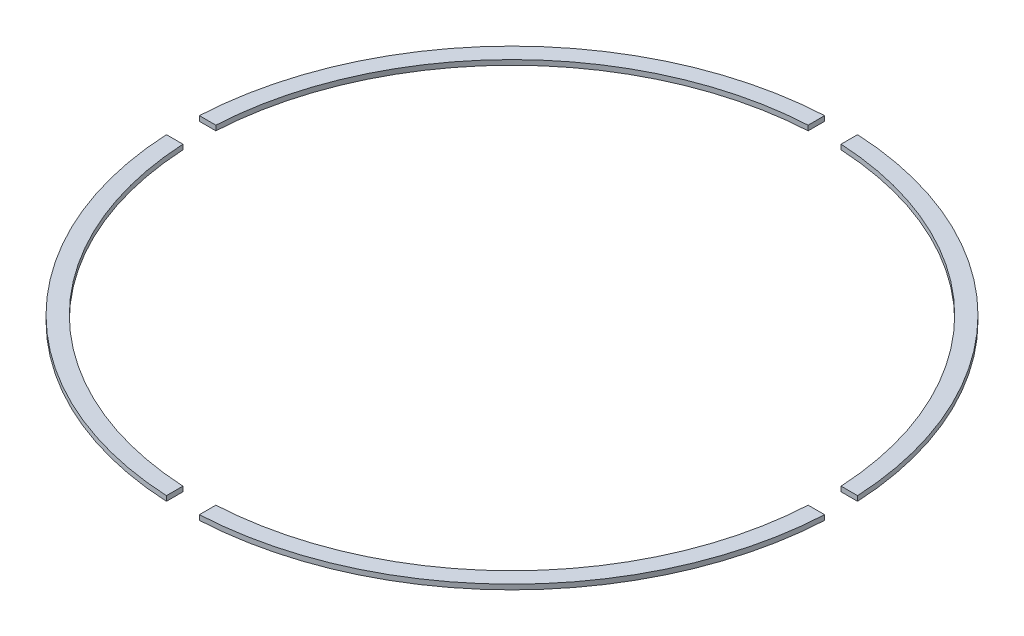
ISO-10303-21;
HEADER;
FILE_DESCRIPTION(('STEP AP214'),'2;1');
FILE_NAME('part.step','',(''),(''),'','','');
FILE_SCHEMA(('AUTOMOTIVE_DESIGN { 1 0 10303 214 1 1 1 1 }'));
ENDSEC;
DATA;
#1=APPLICATION_CONTEXT('core data for automotive mechanical design processes');
#2=APPLICATION_PROTOCOL_DEFINITION('international standard','automotive_design',2000,#1);
#3=PRODUCT_CONTEXT('',#1,'mechanical');
#4=PRODUCT('Part','Part','',(#3));
#5=PRODUCT_RELATED_PRODUCT_CATEGORY('part','',(#4));
#6=PRODUCT_DEFINITION_FORMATION('','',#4);
#7=PRODUCT_DEFINITION_CONTEXT('part definition',#1,'design');
#8=PRODUCT_DEFINITION('design','',#6,#7);
#9=PRODUCT_DEFINITION_SHAPE('','',#8);
#10=(LENGTH_UNIT() NAMED_UNIT(*) SI_UNIT(.MILLI.,.METRE.));
#11=(NAMED_UNIT(*) PLANE_ANGLE_UNIT() SI_UNIT($,.RADIAN.));
#12=(NAMED_UNIT(*) SI_UNIT($,.STERADIAN.) SOLID_ANGLE_UNIT());
#13=UNCERTAINTY_MEASURE_WITH_UNIT(LENGTH_MEASURE(1.E-05),#10,'distance_accuracy_value','');
#14=(GEOMETRIC_REPRESENTATION_CONTEXT(3) GLOBAL_UNCERTAINTY_ASSIGNED_CONTEXT((#13)) GLOBAL_UNIT_ASSIGNED_CONTEXT((#10,
#11,#12)) REPRESENTATION_CONTEXT('',''));
#15=CARTESIAN_POINT('',(0.,0.,0.));
#16=DIRECTION('',(0.,0.,1.));
#17=DIRECTION('',(1.,0.,0.));
#18=AXIS2_PLACEMENT_3D('',#15,#16,#17);
#19=CARTESIAN_POINT('',(0.,1.5,0.));
#20=DIRECTION('',(0.,1.,0.));
#21=DIRECTION('',(0.,0.,1.));
#22=AXIS2_PLACEMENT_3D('',#19,#20,#21);
#23=PLANE('',#22);
#24=DIRECTION('',(-1.,0.,0.));
#25=VECTOR('',#24,1.);
#26=CARTESIAN_POINT('',(200.,1.5,-10.));
#27=LINE('',#26,#25);
#28=CARTESIAN_POINT('',(-189.736659610103,1.5,-10.));
#29=VERTEX_POINT('',#28);
#30=CARTESIAN_POINT('',(-199.749843554382,1.5,-10.));
#31=VERTEX_POINT('',#30);
#32=EDGE_CURVE('E13',#29,#31,#27,.T.);
#33=ORIENTED_EDGE('',*,*,#32,.F.);
#34=CARTESIAN_POINT('',(0.,1.5,0.));
#35=DIRECTION('',(0.,1.,0.));
#36=DIRECTION('',(0.,0.,1.));
#37=AXIS2_PLACEMENT_3D('',#34,#35,#36);
#38=CIRCLE('',#37,190.);
#39=CARTESIAN_POINT('',(-10.,1.5,-189.736659610103));
#40=VERTEX_POINT('',#39);
#41=EDGE_CURVE('E94',#40,#29,#38,.T.);
#42=ORIENTED_EDGE('',*,*,#41,.F.);
#43=DIRECTION('',(0.,0.,1.));
#44=VECTOR('',#43,1.);
#45=CARTESIAN_POINT('',(-10.,1.5,-200.));
#46=LINE('',#45,#44);
#47=CARTESIAN_POINT('',(-10.,1.5,-199.749843554382));
#48=VERTEX_POINT('',#47);
#49=EDGE_CURVE('E128',#48,#40,#46,.T.);
#50=ORIENTED_EDGE('',*,*,#49,.F.);
#51=CARTESIAN_POINT('',(0.,1.5,0.));
#52=DIRECTION('',(0.,1.,0.));
#53=DIRECTION('',(0.,0.,1.));
#54=AXIS2_PLACEMENT_3D('',#51,#52,#53);
#55=CIRCLE('',#54,200.);
#56=EDGE_CURVE('E144',#48,#31,#55,.T.);
#57=ORIENTED_EDGE('',*,*,#56,.T.);
#58=EDGE_LOOP('',(#33,#42,#50,#57));
#59=FACE_BOUND('',#58,.T.);
#60=ADVANCED_FACE('F91',(#59),#23,.T.);
#61=CARTESIAN_POINT('',(0.,-1.5,0.));
#62=DIRECTION('',(0.,1.,0.));
#63=DIRECTION('',(0.,0.,1.));
#64=AXIS2_PLACEMENT_3D('',#61,#62,#63);
#65=PLANE('',#64);
#66=CARTESIAN_POINT('',(0.,-1.5,0.));
#67=DIRECTION('',(0.,1.,0.));
#68=DIRECTION('',(0.,0.,1.));
#69=AXIS2_PLACEMENT_3D('',#66,#67,#68);
#70=CIRCLE('',#69,190.);
#71=CARTESIAN_POINT('',(-10.,-1.5,-189.736659610103));
#72=VERTEX_POINT('',#71);
#73=CARTESIAN_POINT('',(-189.736659610103,-1.5,-10.));
#74=VERTEX_POINT('',#73);
#75=EDGE_CURVE('E158',#72,#74,#70,.T.);
#76=ORIENTED_EDGE('',*,*,#75,.T.);
#77=DIRECTION('',(-1.,0.,0.));
#78=VECTOR('',#77,1.);
#79=CARTESIAN_POINT('',(200.,-1.5,-10.));
#80=LINE('',#79,#78);
#81=CARTESIAN_POINT('',(-199.749843554382,-1.5,-10.));
#82=VERTEX_POINT('',#81);
#83=EDGE_CURVE('E131',#74,#82,#80,.T.);
#84=ORIENTED_EDGE('',*,*,#83,.T.);
#85=CARTESIAN_POINT('',(0.,-1.5,0.));
#86=DIRECTION('',(0.,1.,0.));
#87=DIRECTION('',(0.,0.,1.));
#88=AXIS2_PLACEMENT_3D('',#85,#86,#87);
#89=CIRCLE('',#88,200.);
#90=CARTESIAN_POINT('',(-10.,-1.5,-199.749843554382));
#91=VERTEX_POINT('',#90);
#92=EDGE_CURVE('E153',#91,#82,#89,.T.);
#93=ORIENTED_EDGE('',*,*,#92,.F.);
#94=DIRECTION('',(0.,0.,1.));
#95=VECTOR('',#94,1.);
#96=CARTESIAN_POINT('',(-10.,-1.5,-200.));
#97=LINE('',#96,#95);
#98=EDGE_CURVE('E157',#91,#72,#97,.T.);
#99=ORIENTED_EDGE('',*,*,#98,.T.);
#100=EDGE_LOOP('',(#76,#84,#93,#99));
#101=FACE_BOUND('',#100,.T.);
#102=ADVANCED_FACE('F164',(#101),#65,.F.);
#103=CARTESIAN_POINT('',(0.,1.5,0.));
#104=DIRECTION('',(0.,-1.,0.));
#105=DIRECTION('',(0.,0.,-1.));
#106=AXIS2_PLACEMENT_3D('',#103,#104,#105);
#107=CYLINDRICAL_SURFACE('',#106,200.);
#108=ORIENTED_EDGE('',*,*,#92,.T.);
#109=DIRECTION('',(0.,-1.,0.));
#110=VECTOR('',#109,1.);
#111=CARTESIAN_POINT('',(-199.749843554382,1.5,-10.));
#112=LINE('',#111,#110);
#113=EDGE_CURVE('E108',#82,#31,#112,.F.);
#114=ORIENTED_EDGE('',*,*,#113,.T.);
#115=ORIENTED_EDGE('',*,*,#56,.F.);
#116=DIRECTION('',(0.,-1.,0.));
#117=VECTOR('',#116,1.);
#118=CARTESIAN_POINT('',(-10.,1.5,-199.749843554382));
#119=LINE('',#118,#117);
#120=EDGE_CURVE('E146',#48,#91,#119,.T.);
#121=ORIENTED_EDGE('',*,*,#120,.T.);
#122=EDGE_LOOP('',(#108,#114,#115,#121));
#123=FACE_BOUND('',#122,.T.);
#124=ADVANCED_FACE('F162',(#123),#107,.T.);
#125=CARTESIAN_POINT('',(0.,1.5,0.));
#126=DIRECTION('',(0.,-1.,0.));
#127=DIRECTION('',(0.,0.,-1.));
#128=AXIS2_PLACEMENT_3D('',#125,#126,#127);
#129=CYLINDRICAL_SURFACE('',#128,190.);
#130=DIRECTION('',(0.,-1.,0.));
#131=VECTOR('',#130,1.);
#132=CARTESIAN_POINT('',(-189.736659610103,1.5,-10.));
#133=LINE('',#132,#131);
#134=EDGE_CURVE('E100',#74,#29,#133,.F.);
#135=ORIENTED_EDGE('',*,*,#134,.F.);
#136=ORIENTED_EDGE('',*,*,#75,.F.);
#137=DIRECTION('',(0.,-1.,0.));
#138=VECTOR('',#137,1.);
#139=CARTESIAN_POINT('',(-10.,1.5,-189.736659610103));
#140=LINE('',#139,#138);
#141=EDGE_CURVE('E124',#40,#72,#140,.T.);
#142=ORIENTED_EDGE('',*,*,#141,.F.);
#143=ORIENTED_EDGE('',*,*,#41,.T.);
#144=EDGE_LOOP('',(#135,#136,#142,#143));
#145=FACE_BOUND('',#144,.T.);
#146=ADVANCED_FACE('F145',(#145),#129,.F.);
#147=CARTESIAN_POINT('',(-10.,-1.5,-200.));
#148=DIRECTION('',(-1.,0.,0.));
#149=DIRECTION('',(0.,0.,1.));
#150=AXIS2_PLACEMENT_3D('',#147,#148,#149);
#151=PLANE('',#150);
#152=ORIENTED_EDGE('',*,*,#49,.T.);
#153=ORIENTED_EDGE('',*,*,#141,.T.);
#154=ORIENTED_EDGE('',*,*,#98,.F.);
#155=ORIENTED_EDGE('',*,*,#120,.F.);
#156=EDGE_LOOP('',(#152,#153,#154,#155));
#157=FACE_BOUND('',#156,.T.);
#158=ADVANCED_FACE('F165',(#157),#151,.F.);
#159=CARTESIAN_POINT('',(200.,-1.5,-10.));
#160=DIRECTION('',(0.,0.,-1.));
#161=DIRECTION('',(-1.,0.,0.));
#162=AXIS2_PLACEMENT_3D('',#159,#160,#161);
#163=PLANE('',#162);
#164=ORIENTED_EDGE('',*,*,#83,.F.);
#165=ORIENTED_EDGE('',*,*,#134,.T.);
#166=ORIENTED_EDGE('',*,*,#32,.T.);
#167=ORIENTED_EDGE('',*,*,#113,.F.);
#168=EDGE_LOOP('',(#164,#165,#166,#167));
#169=FACE_BOUND('',#168,.T.);
#170=ADVANCED_FACE('F134',(#169),#163,.F.);
#171=CLOSED_SHELL('',(#60,#102,#124,#146,#158,#170));
#172=MANIFOLD_SOLID_BREP('B2',#171);
#173=CARTESIAN_POINT('',(0.,1.5,0.));
#174=DIRECTION('',(0.,-1.,0.));
#175=DIRECTION('',(0.,0.,-1.));
#176=AXIS2_PLACEMENT_3D('',#173,#174,#175);
#177=CYLINDRICAL_SURFACE('',#176,190.);
#178=CARTESIAN_POINT('',(0.,1.5,0.));
#179=DIRECTION('',(0.,1.,0.));
#180=DIRECTION('',(0.,0.,1.));
#181=AXIS2_PLACEMENT_3D('',#178,#179,#180);
#182=CIRCLE('',#181,190.);
#183=CARTESIAN_POINT('',(10.,1.5,189.736659610103));
#184=VERTEX_POINT('',#183);
#185=CARTESIAN_POINT('',(189.736659610103,1.5,10.));
#186=VERTEX_POINT('',#185);
#187=EDGE_CURVE('E280',#184,#186,#182,.T.);
#188=ORIENTED_EDGE('',*,*,#187,.T.);
#189=DIRECTION('',(0.,-1.,0.));
#190=VECTOR('',#189,1.);
#191=CARTESIAN_POINT('',(189.736659610103,1.5,10.));
#192=LINE('',#191,#190);
#193=CARTESIAN_POINT('',(189.736659610103,-1.5,10.));
#194=VERTEX_POINT('',#193);
#195=EDGE_CURVE('E270',#186,#194,#192,.T.);
#196=ORIENTED_EDGE('',*,*,#195,.T.);
#197=CARTESIAN_POINT('',(0.,-1.5,0.));
#198=DIRECTION('',(0.,1.,0.));
#199=DIRECTION('',(0.,0.,1.));
#200=AXIS2_PLACEMENT_3D('',#197,#198,#199);
#201=CIRCLE('',#200,190.);
#202=CARTESIAN_POINT('',(10.,-1.5,189.736659610103));
#203=VERTEX_POINT('',#202);
#204=EDGE_CURVE('E278',#203,#194,#201,.T.);
#205=ORIENTED_EDGE('',*,*,#204,.F.);
#206=DIRECTION('',(0.,-1.,0.));
#207=VECTOR('',#206,1.);
#208=CARTESIAN_POINT('',(10.,1.5,189.736659610103));
#209=LINE('',#208,#207);
#210=EDGE_CURVE('E263',#203,#184,#209,.F.);
#211=ORIENTED_EDGE('',*,*,#210,.T.);
#212=EDGE_LOOP('',(#188,#196,#205,#211));
#213=FACE_BOUND('',#212,.T.);
#214=ADVANCED_FACE('F224',(#213),#177,.F.);
#215=CARTESIAN_POINT('',(0.,1.5,0.));
#216=DIRECTION('',(0.,-1.,0.));
#217=DIRECTION('',(0.,0.,-1.));
#218=AXIS2_PLACEMENT_3D('',#215,#216,#217);
#219=CYLINDRICAL_SURFACE('',#218,200.);
#220=DIRECTION('',(0.,-1.,0.));
#221=VECTOR('',#220,1.);
#222=CARTESIAN_POINT('',(199.749843554382,1.5,10.));
#223=LINE('',#222,#221);
#224=CARTESIAN_POINT('',(199.749843554382,1.5,10.));
#225=VERTEX_POINT('',#224);
#226=CARTESIAN_POINT('',(199.749843554382,-1.5,10.));
#227=VERTEX_POINT('',#226);
#228=EDGE_CURVE('E234',#225,#227,#223,.T.);
#229=ORIENTED_EDGE('',*,*,#228,.F.);
#230=CARTESIAN_POINT('',(0.,1.5,0.));
#231=DIRECTION('',(0.,1.,0.));
#232=DIRECTION('',(0.,0.,1.));
#233=AXIS2_PLACEMENT_3D('',#230,#231,#232);
#234=CIRCLE('',#233,200.);
#235=CARTESIAN_POINT('',(10.,1.5,199.749843554382));
#236=VERTEX_POINT('',#235);
#237=EDGE_CURVE('E283',#236,#225,#234,.T.);
#238=ORIENTED_EDGE('',*,*,#237,.F.);
#239=DIRECTION('',(0.,-1.,0.));
#240=VECTOR('',#239,1.);
#241=CARTESIAN_POINT('',(10.,1.5,199.749843554382));
#242=LINE('',#241,#240);
#243=CARTESIAN_POINT('',(10.,-1.5,199.749843554382));
#244=VERTEX_POINT('',#243);
#245=EDGE_CURVE('E290',#244,#236,#242,.F.);
#246=ORIENTED_EDGE('',*,*,#245,.F.);
#247=CARTESIAN_POINT('',(0.,-1.5,0.));
#248=DIRECTION('',(0.,1.,0.));
#249=DIRECTION('',(0.,0.,1.));
#250=AXIS2_PLACEMENT_3D('',#247,#248,#249);
#251=CIRCLE('',#250,200.);
#252=EDGE_CURVE('E228',#244,#227,#251,.T.);
#253=ORIENTED_EDGE('',*,*,#252,.T.);
#254=EDGE_LOOP('',(#229,#238,#246,#253));
#255=FACE_BOUND('',#254,.T.);
#256=ADVANCED_FACE('F297',(#255),#219,.T.);
#257=CARTESIAN_POINT('',(0.,-1.5,0.));
#258=DIRECTION('',(0.,1.,0.));
#259=DIRECTION('',(0.,0.,1.));
#260=AXIS2_PLACEMENT_3D('',#257,#258,#259);
#261=PLANE('',#260);
#262=DIRECTION('',(-1.,0.,0.));
#263=VECTOR('',#262,1.);
#264=CARTESIAN_POINT('',(200.,-1.5,10.));
#265=LINE('',#264,#263);
#266=EDGE_CURVE('E89',#227,#194,#265,.T.);
#267=ORIENTED_EDGE('',*,*,#266,.F.);
#268=ORIENTED_EDGE('',*,*,#252,.F.);
#269=DIRECTION('',(0.,0.,1.));
#270=VECTOR('',#269,1.);
#271=CARTESIAN_POINT('',(10.,-1.5,-200.));
#272=LINE('',#271,#270);
#273=EDGE_CURVE('E259',#203,#244,#272,.T.);
#274=ORIENTED_EDGE('',*,*,#273,.F.);
#275=ORIENTED_EDGE('',*,*,#204,.T.);
#276=EDGE_LOOP('',(#267,#268,#274,#275));
#277=FACE_BOUND('',#276,.T.);
#278=ADVANCED_FACE('F282',(#277),#261,.F.);
#279=CARTESIAN_POINT('',(0.,1.5,0.));
#280=DIRECTION('',(0.,1.,0.));
#281=DIRECTION('',(0.,0.,1.));
#282=AXIS2_PLACEMENT_3D('',#279,#280,#281);
#283=PLANE('',#282);
#284=ORIENTED_EDGE('',*,*,#237,.T.);
#285=DIRECTION('',(-1.,0.,0.));
#286=VECTOR('',#285,1.);
#287=CARTESIAN_POINT('',(200.,1.5,10.));
#288=LINE('',#287,#286);
#289=EDGE_CURVE('E243',#225,#186,#288,.T.);
#290=ORIENTED_EDGE('',*,*,#289,.T.);
#291=ORIENTED_EDGE('',*,*,#187,.F.);
#292=DIRECTION('',(0.,0.,1.));
#293=VECTOR('',#292,1.);
#294=CARTESIAN_POINT('',(10.,1.5,-200.));
#295=LINE('',#294,#293);
#296=EDGE_CURVE('E265',#184,#236,#295,.T.);
#297=ORIENTED_EDGE('',*,*,#296,.T.);
#298=EDGE_LOOP('',(#284,#290,#291,#297));
#299=FACE_BOUND('',#298,.T.);
#300=ADVANCED_FACE('F226',(#299),#283,.T.);
#301=CARTESIAN_POINT('',(10.,-1.5,-200.));
#302=DIRECTION('',(-1.,0.,0.));
#303=DIRECTION('',(0.,0.,1.));
#304=AXIS2_PLACEMENT_3D('',#301,#302,#303);
#305=PLANE('',#304);
#306=ORIENTED_EDGE('',*,*,#245,.T.);
#307=ORIENTED_EDGE('',*,*,#296,.F.);
#308=ORIENTED_EDGE('',*,*,#210,.F.);
#309=ORIENTED_EDGE('',*,*,#273,.T.);
#310=EDGE_LOOP('',(#306,#307,#308,#309));
#311=FACE_BOUND('',#310,.T.);
#312=ADVANCED_FACE('F298',(#311),#305,.T.);
#313=CARTESIAN_POINT('',(200.,-1.5,10.));
#314=DIRECTION('',(0.,0.,-1.));
#315=DIRECTION('',(-1.,0.,0.));
#316=AXIS2_PLACEMENT_3D('',#313,#314,#315);
#317=PLANE('',#316);
#318=ORIENTED_EDGE('',*,*,#228,.T.);
#319=ORIENTED_EDGE('',*,*,#266,.T.);
#320=ORIENTED_EDGE('',*,*,#195,.F.);
#321=ORIENTED_EDGE('',*,*,#289,.F.);
#322=EDGE_LOOP('',(#318,#319,#320,#321));
#323=FACE_BOUND('',#322,.T.);
#324=ADVANCED_FACE('F269',(#323),#317,.T.);
#325=CLOSED_SHELL('',(#214,#256,#278,#300,#312,#324));
#326=MANIFOLD_SOLID_BREP('B7',#325);
#327=CARTESIAN_POINT('',(0.,1.5,0.));
#328=DIRECTION('',(0.,-1.,0.));
#329=DIRECTION('',(0.,0.,-1.));
#330=AXIS2_PLACEMENT_3D('',#327,#328,#329);
#331=CYLINDRICAL_SURFACE('',#330,200.);
#332=DIRECTION('',(0.,-1.,0.));
#333=VECTOR('',#332,1.);
#334=CARTESIAN_POINT('',(-199.749843554382,1.5,10.));
#335=LINE('',#334,#333);
#336=CARTESIAN_POINT('',(-199.749843554382,-1.5,10.));
#337=VERTEX_POINT('',#336);
#338=CARTESIAN_POINT('',(-199.749843554382,1.5,10.));
#339=VERTEX_POINT('',#338);
#340=EDGE_CURVE('E366',#337,#339,#335,.F.);
#341=ORIENTED_EDGE('',*,*,#340,.F.);
#342=CARTESIAN_POINT('',(0.,-1.5,0.));
#343=DIRECTION('',(0.,1.,0.));
#344=DIRECTION('',(0.,0.,1.));
#345=AXIS2_PLACEMENT_3D('',#342,#343,#344);
#346=CIRCLE('',#345,200.);
#347=CARTESIAN_POINT('',(-10.,-1.5,199.749843554382));
#348=VERTEX_POINT('',#347);
#349=EDGE_CURVE('E407',#337,#348,#346,.T.);
#350=ORIENTED_EDGE('',*,*,#349,.T.);
#351=DIRECTION('',(0.,-1.,0.));
#352=VECTOR('',#351,1.);
#353=CARTESIAN_POINT('',(-10.,1.5,199.749843554382));
#354=LINE('',#353,#352);
#355=CARTESIAN_POINT('',(-10.,1.5,199.749843554382));
#356=VERTEX_POINT('',#355);
#357=EDGE_CURVE('E400',#348,#356,#354,.F.);
#358=ORIENTED_EDGE('',*,*,#357,.T.);
#359=CARTESIAN_POINT('',(0.,1.5,0.));
#360=DIRECTION('',(0.,1.,0.));
#361=DIRECTION('',(0.,0.,1.));
#362=AXIS2_PLACEMENT_3D('',#359,#360,#361);
#363=CIRCLE('',#362,200.);
#364=EDGE_CURVE('E419',#339,#356,#363,.T.);
#365=ORIENTED_EDGE('',*,*,#364,.F.);
#366=EDGE_LOOP('',(#341,#350,#358,#365));
#367=FACE_BOUND('',#366,.T.);
#368=ADVANCED_FACE('F356',(#367),#331,.T.);
#369=CARTESIAN_POINT('',(0.,1.5,0.));
#370=DIRECTION('',(0.,-1.,0.));
#371=DIRECTION('',(0.,0.,-1.));
#372=AXIS2_PLACEMENT_3D('',#369,#370,#371);
#373=CYLINDRICAL_SURFACE('',#372,190.);
#374=CARTESIAN_POINT('',(0.,-1.5,0.));
#375=DIRECTION('',(0.,1.,0.));
#376=DIRECTION('',(0.,0.,1.));
#377=AXIS2_PLACEMENT_3D('',#374,#375,#376);
#378=CIRCLE('',#377,190.);
#379=CARTESIAN_POINT('',(-189.736659610103,-1.5,10.));
#380=VERTEX_POINT('',#379);
#381=CARTESIAN_POINT('',(-10.,-1.5,189.736659610103));
#382=VERTEX_POINT('',#381);
#383=EDGE_CURVE('E414',#380,#382,#378,.T.);
#384=ORIENTED_EDGE('',*,*,#383,.F.);
#385=DIRECTION('',(0.,-1.,0.));
#386=VECTOR('',#385,1.);
#387=CARTESIAN_POINT('',(-189.736659610103,1.5,10.));
#388=LINE('',#387,#386);
#389=CARTESIAN_POINT('',(-189.736659610103,1.5,10.));
#390=VERTEX_POINT('',#389);
#391=EDGE_CURVE('E406',#380,#390,#388,.F.);
#392=ORIENTED_EDGE('',*,*,#391,.T.);
#393=CARTESIAN_POINT('',(0.,1.5,0.));
#394=DIRECTION('',(0.,1.,0.));
#395=DIRECTION('',(0.,0.,1.));
#396=AXIS2_PLACEMENT_3D('',#393,#394,#395);
#397=CIRCLE('',#396,190.);
#398=CARTESIAN_POINT('',(-10.,1.5,189.736659610103));
#399=VERTEX_POINT('',#398);
#400=EDGE_CURVE('E360',#390,#399,#397,.T.);
#401=ORIENTED_EDGE('',*,*,#400,.T.);
#402=DIRECTION('',(0.,-1.,0.));
#403=VECTOR('',#402,1.);
#404=CARTESIAN_POINT('',(-10.,1.5,189.736659610103));
#405=LINE('',#404,#403);
#406=EDGE_CURVE('E389',#382,#399,#405,.F.);
#407=ORIENTED_EDGE('',*,*,#406,.F.);
#408=EDGE_LOOP('',(#384,#392,#401,#407));
#409=FACE_BOUND('',#408,.T.);
#410=ADVANCED_FACE('F435',(#409),#373,.F.);
#411=CARTESIAN_POINT('',(0.,-1.5,0.));
#412=DIRECTION('',(0.,1.,0.));
#413=DIRECTION('',(0.,0.,1.));
#414=AXIS2_PLACEMENT_3D('',#411,#412,#413);
#415=PLANE('',#414);
#416=DIRECTION('',(-1.,0.,0.));
#417=VECTOR('',#416,1.);
#418=CARTESIAN_POINT('',(200.,-1.5,10.));
#419=LINE('',#418,#417);
#420=EDGE_CURVE('E222',#380,#337,#419,.T.);
#421=ORIENTED_EDGE('',*,*,#420,.F.);
#422=ORIENTED_EDGE('',*,*,#383,.T.);
#423=DIRECTION('',(0.,0.,1.));
#424=VECTOR('',#423,1.);
#425=CARTESIAN_POINT('',(-10.,-1.5,-200.));
#426=LINE('',#425,#424);
#427=EDGE_CURVE('E394',#382,#348,#426,.T.);
#428=ORIENTED_EDGE('',*,*,#427,.T.);
#429=ORIENTED_EDGE('',*,*,#349,.F.);
#430=EDGE_LOOP('',(#421,#422,#428,#429));
#431=FACE_BOUND('',#430,.T.);
#432=ADVANCED_FACE('F412',(#431),#415,.F.);
#433=CARTESIAN_POINT('',(0.,1.5,0.));
#434=DIRECTION('',(0.,1.,0.));
#435=DIRECTION('',(0.,0.,1.));
#436=AXIS2_PLACEMENT_3D('',#433,#434,#435);
#437=PLANE('',#436);
#438=ORIENTED_EDGE('',*,*,#400,.F.);
#439=DIRECTION('',(-1.,0.,0.));
#440=VECTOR('',#439,1.);
#441=CARTESIAN_POINT('',(200.,1.5,10.));
#442=LINE('',#441,#440);
#443=EDGE_CURVE('E397',#390,#339,#442,.T.);
#444=ORIENTED_EDGE('',*,*,#443,.T.);
#445=ORIENTED_EDGE('',*,*,#364,.T.);
#446=DIRECTION('',(0.,0.,1.));
#447=VECTOR('',#446,1.);
#448=CARTESIAN_POINT('',(-10.,1.5,-200.));
#449=LINE('',#448,#447);
#450=EDGE_CURVE('E401',#399,#356,#449,.T.);
#451=ORIENTED_EDGE('',*,*,#450,.F.);
#452=EDGE_LOOP('',(#438,#444,#445,#451));
#453=FACE_BOUND('',#452,.T.);
#454=ADVANCED_FACE('F428',(#453),#437,.T.);
#455=CARTESIAN_POINT('',(-10.,-1.5,-200.));
#456=DIRECTION('',(-1.,0.,0.));
#457=DIRECTION('',(0.,0.,1.));
#458=AXIS2_PLACEMENT_3D('',#455,#456,#457);
#459=PLANE('',#458);
#460=ORIENTED_EDGE('',*,*,#427,.F.);
#461=ORIENTED_EDGE('',*,*,#406,.T.);
#462=ORIENTED_EDGE('',*,*,#450,.T.);
#463=ORIENTED_EDGE('',*,*,#357,.F.);
#464=EDGE_LOOP('',(#460,#461,#462,#463));
#465=FACE_BOUND('',#464,.T.);
#466=ADVANCED_FACE('F358',(#465),#459,.F.);
#467=CARTESIAN_POINT('',(200.,-1.5,10.));
#468=DIRECTION('',(0.,0.,-1.));
#469=DIRECTION('',(-1.,0.,0.));
#470=AXIS2_PLACEMENT_3D('',#467,#468,#469);
#471=PLANE('',#470);
#472=ORIENTED_EDGE('',*,*,#340,.T.);
#473=ORIENTED_EDGE('',*,*,#443,.F.);
#474=ORIENTED_EDGE('',*,*,#391,.F.);
#475=ORIENTED_EDGE('',*,*,#420,.T.);
#476=EDGE_LOOP('',(#472,#473,#474,#475));
#477=FACE_BOUND('',#476,.T.);
#478=ADVANCED_FACE('F434',(#477),#471,.T.);
#479=CLOSED_SHELL('',(#368,#410,#432,#454,#466,#478));
#480=MANIFOLD_SOLID_BREP('B83',#479);
#481=CARTESIAN_POINT('',(0.,1.5,0.));
#482=DIRECTION('',(0.,-1.,0.));
#483=DIRECTION('',(0.,0.,-1.));
#484=AXIS2_PLACEMENT_3D('',#481,#482,#483);
#485=CYLINDRICAL_SURFACE('',#484,190.);
#486=DIRECTION('',(0.,-1.,0.));
#487=VECTOR('',#486,1.);
#488=CARTESIAN_POINT('',(189.736659610103,1.5,-10.));
#489=LINE('',#488,#487);
#490=CARTESIAN_POINT('',(189.736659610103,1.5,-10.));
#491=VERTEX_POINT('',#490);
#492=CARTESIAN_POINT('',(189.736659610103,-1.5,-10.));
#493=VERTEX_POINT('',#492);
#494=EDGE_CURVE('E354',#491,#493,#489,.T.);
#495=ORIENTED_EDGE('',*,*,#494,.F.);
#496=CARTESIAN_POINT('',(0.,1.5,0.));
#497=DIRECTION('',(0.,1.,0.));
#498=DIRECTION('',(0.,0.,1.));
#499=AXIS2_PLACEMENT_3D('',#496,#497,#498);
#500=CIRCLE('',#499,190.);
#501=CARTESIAN_POINT('',(10.,1.5,-189.736659610103));
#502=VERTEX_POINT('',#501);
#503=EDGE_CURVE('E539',#491,#502,#500,.T.);
#504=ORIENTED_EDGE('',*,*,#503,.T.);
#505=DIRECTION('',(0.,-1.,0.));
#506=VECTOR('',#505,1.);
#507=CARTESIAN_POINT('',(10.,1.5,-189.736659610103));
#508=LINE('',#507,#506);
#509=CARTESIAN_POINT('',(10.,-1.5,-189.736659610103));
#510=VERTEX_POINT('',#509);
#511=EDGE_CURVE('E487',#502,#510,#508,.T.);
#512=ORIENTED_EDGE('',*,*,#511,.T.);
#513=CARTESIAN_POINT('',(0.,-1.5,0.));
#514=DIRECTION('',(0.,1.,0.));
#515=DIRECTION('',(0.,0.,1.));
#516=AXIS2_PLACEMENT_3D('',#513,#514,#515);
#517=CIRCLE('',#516,190.);
#518=EDGE_CURVE('E535',#493,#510,#517,.T.);
#519=ORIENTED_EDGE('',*,*,#518,.F.);
#520=EDGE_LOOP('',(#495,#504,#512,#519));
#521=FACE_BOUND('',#520,.T.);
#522=ADVANCED_FACE('F479',(#521),#485,.F.);
#523=CARTESIAN_POINT('',(0.,1.5,0.));
#524=DIRECTION('',(0.,-1.,0.));
#525=DIRECTION('',(0.,0.,-1.));
#526=AXIS2_PLACEMENT_3D('',#523,#524,#525);
#527=CYLINDRICAL_SURFACE('',#526,200.);
#528=CARTESIAN_POINT('',(0.,1.5,0.));
#529=DIRECTION('',(0.,1.,0.));
#530=DIRECTION('',(0.,0.,1.));
#531=AXIS2_PLACEMENT_3D('',#528,#529,#530);
#532=CIRCLE('',#531,200.);
#533=CARTESIAN_POINT('',(199.749843554382,1.5,-10.));
#534=VERTEX_POINT('',#533);
#535=CARTESIAN_POINT('',(10.,1.5,-199.749843554382));
#536=VERTEX_POINT('',#535);
#537=EDGE_CURVE('E538',#534,#536,#532,.T.);
#538=ORIENTED_EDGE('',*,*,#537,.F.);
#539=DIRECTION('',(0.,-1.,0.));
#540=VECTOR('',#539,1.);
#541=CARTESIAN_POINT('',(199.749843554382,1.5,-10.));
#542=LINE('',#541,#540);
#543=CARTESIAN_POINT('',(199.749843554382,-1.5,-10.));
#544=VERTEX_POINT('',#543);
#545=EDGE_CURVE('E525',#534,#544,#542,.T.);
#546=ORIENTED_EDGE('',*,*,#545,.T.);
#547=CARTESIAN_POINT('',(0.,-1.5,0.));
#548=DIRECTION('',(0.,1.,0.));
#549=DIRECTION('',(0.,0.,1.));
#550=AXIS2_PLACEMENT_3D('',#547,#548,#549);
#551=CIRCLE('',#550,200.);
#552=CARTESIAN_POINT('',(10.,-1.5,-199.749843554382));
#553=VERTEX_POINT('',#552);
#554=EDGE_CURVE('E533',#544,#553,#551,.T.);
#555=ORIENTED_EDGE('',*,*,#554,.T.);
#556=DIRECTION('',(0.,-1.,0.));
#557=VECTOR('',#556,1.);
#558=CARTESIAN_POINT('',(10.,1.5,-199.749843554382));
#559=LINE('',#558,#557);
#560=EDGE_CURVE('E517',#536,#553,#559,.T.);
#561=ORIENTED_EDGE('',*,*,#560,.F.);
#562=EDGE_LOOP('',(#538,#546,#555,#561));
#563=FACE_BOUND('',#562,.T.);
#564=ADVANCED_FACE('F481',(#563),#527,.T.);
#565=CARTESIAN_POINT('',(0.,-1.5,0.));
#566=DIRECTION('',(0.,1.,0.));
#567=DIRECTION('',(0.,0.,1.));
#568=AXIS2_PLACEMENT_3D('',#565,#566,#567);
#569=PLANE('',#568);
#570=ORIENTED_EDGE('',*,*,#554,.F.);
#571=DIRECTION('',(-1.,0.,0.));
#572=VECTOR('',#571,1.);
#573=CARTESIAN_POINT('',(200.,-1.5,-10.));
#574=LINE('',#573,#572);
#575=EDGE_CURVE('E526',#544,#493,#574,.T.);
#576=ORIENTED_EDGE('',*,*,#575,.T.);
#577=ORIENTED_EDGE('',*,*,#518,.T.);
#578=DIRECTION('',(0.,0.,1.));
#579=VECTOR('',#578,1.);
#580=CARTESIAN_POINT('',(10.,-1.5,-200.));
#581=LINE('',#580,#579);
#582=EDGE_CURVE('E494',#553,#510,#581,.T.);
#583=ORIENTED_EDGE('',*,*,#582,.F.);
#584=EDGE_LOOP('',(#570,#576,#577,#583));
#585=FACE_BOUND('',#584,.T.);
#586=ADVANCED_FACE('F531',(#585),#569,.F.);
#587=CARTESIAN_POINT('',(0.,1.5,0.));
#588=DIRECTION('',(0.,1.,0.));
#589=DIRECTION('',(0.,0.,1.));
#590=AXIS2_PLACEMENT_3D('',#587,#588,#589);
#591=PLANE('',#590);
#592=DIRECTION('',(-1.,0.,0.));
#593=VECTOR('',#592,1.);
#594=CARTESIAN_POINT('',(200.,1.5,-10.));
#595=LINE('',#594,#593);
#596=EDGE_CURVE('E501',#534,#491,#595,.T.);
#597=ORIENTED_EDGE('',*,*,#596,.F.);
#598=ORIENTED_EDGE('',*,*,#537,.T.);
#599=DIRECTION('',(0.,0.,1.));
#600=VECTOR('',#599,1.);
#601=CARTESIAN_POINT('',(10.,1.5,-200.));
#602=LINE('',#601,#600);
#603=EDGE_CURVE('E520',#536,#502,#602,.T.);
#604=ORIENTED_EDGE('',*,*,#603,.T.);
#605=ORIENTED_EDGE('',*,*,#503,.F.);
#606=EDGE_LOOP('',(#597,#598,#604,#605));
#607=FACE_BOUND('',#606,.T.);
#608=ADVANCED_FACE('F548',(#607),#591,.T.);
#609=CARTESIAN_POINT('',(10.,-1.5,-200.));
#610=DIRECTION('',(-1.,0.,0.));
#611=DIRECTION('',(0.,0.,1.));
#612=AXIS2_PLACEMENT_3D('',#609,#610,#611);
#613=PLANE('',#612);
#614=ORIENTED_EDGE('',*,*,#560,.T.);
#615=ORIENTED_EDGE('',*,*,#582,.T.);
#616=ORIENTED_EDGE('',*,*,#511,.F.);
#617=ORIENTED_EDGE('',*,*,#603,.F.);
#618=EDGE_LOOP('',(#614,#615,#616,#617));
#619=FACE_BOUND('',#618,.T.);
#620=ADVANCED_FACE('F518',(#619),#613,.T.);
#621=CARTESIAN_POINT('',(200.,-1.5,-10.));
#622=DIRECTION('',(0.,0.,-1.));
#623=DIRECTION('',(-1.,0.,0.));
#624=AXIS2_PLACEMENT_3D('',#621,#622,#623);
#625=PLANE('',#624);
#626=ORIENTED_EDGE('',*,*,#596,.T.);
#627=ORIENTED_EDGE('',*,*,#494,.T.);
#628=ORIENTED_EDGE('',*,*,#575,.F.);
#629=ORIENTED_EDGE('',*,*,#545,.F.);
#630=EDGE_LOOP('',(#626,#627,#628,#629));
#631=FACE_BOUND('',#630,.T.);
#632=ADVANCED_FACE('F553',(#631),#625,.F.);
#633=CLOSED_SHELL('',(#522,#564,#586,#608,#620,#632));
#634=MANIFOLD_SOLID_BREP('B216',#633);
#635=ADVANCED_BREP_SHAPE_REPRESENTATION('',(#18,#172,#326,#480,#634),#14);
#636=SHAPE_DEFINITION_REPRESENTATION(#9,#635);
ENDSEC;
END-ISO-10303-21;
